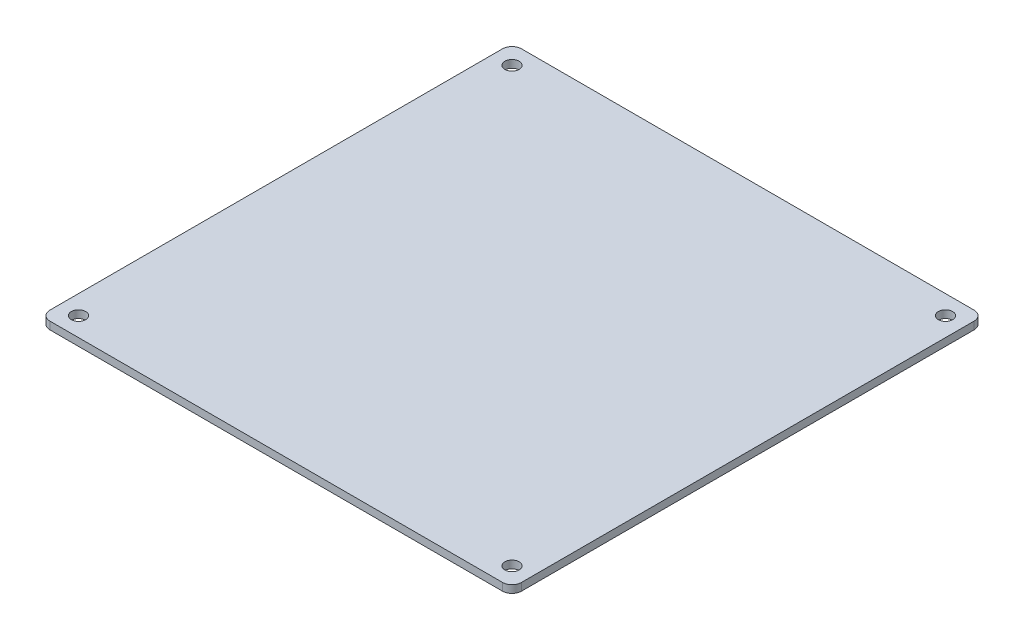
ISO-10303-21;
HEADER;
FILE_DESCRIPTION(('STEP AP214'),'2;1');
FILE_NAME('part.step','',(''),(''),'','','');
FILE_SCHEMA(('AUTOMOTIVE_DESIGN { 1 0 10303 214 1 1 1 1 }'));
ENDSEC;
DATA;
#1=APPLICATION_CONTEXT('core data for automotive mechanical design processes');
#2=APPLICATION_PROTOCOL_DEFINITION('international standard','automotive_design',2000,#1);
#3=PRODUCT_CONTEXT('',#1,'mechanical');
#4=PRODUCT('Part','Part','',(#3));
#5=PRODUCT_RELATED_PRODUCT_CATEGORY('part','',(#4));
#6=PRODUCT_DEFINITION_FORMATION('','',#4);
#7=PRODUCT_DEFINITION_CONTEXT('part definition',#1,'design');
#8=PRODUCT_DEFINITION('design','',#6,#7);
#9=PRODUCT_DEFINITION_SHAPE('','',#8);
#10=(LENGTH_UNIT() NAMED_UNIT(*) SI_UNIT(.MILLI.,.METRE.));
#11=(NAMED_UNIT(*) PLANE_ANGLE_UNIT() SI_UNIT($,.RADIAN.));
#12=(NAMED_UNIT(*) SI_UNIT($,.STERADIAN.) SOLID_ANGLE_UNIT());
#13=UNCERTAINTY_MEASURE_WITH_UNIT(LENGTH_MEASURE(1.E-05),#10,'distance_accuracy_value','');
#14=(GEOMETRIC_REPRESENTATION_CONTEXT(3) GLOBAL_UNCERTAINTY_ASSIGNED_CONTEXT((#13)) GLOBAL_UNIT_ASSIGNED_CONTEXT((#10,
#11,#12)) REPRESENTATION_CONTEXT('',''));
#15=CARTESIAN_POINT('',(0.,0.,0.));
#16=DIRECTION('',(0.,0.,1.));
#17=DIRECTION('',(1.,0.,0.));
#18=AXIS2_PLACEMENT_3D('',#15,#16,#17);
#19=CARTESIAN_POINT('',(0.,1.6,0.));
#20=DIRECTION('',(0.,-1.,0.));
#21=DIRECTION('',(0.,0.,-1.));
#22=AXIS2_PLACEMENT_3D('',#19,#20,#21);
#23=PLANE('',#22);
#24=DIRECTION('',(0.,0.,-1.));
#25=VECTOR('',#24,1.);
#26=CARTESIAN_POINT('',(49.5,1.6,49.5));
#27=LINE('',#26,#25);
#28=CARTESIAN_POINT('',(49.5,1.6,47.5));
#29=VERTEX_POINT('',#28);
#30=CARTESIAN_POINT('',(49.5,1.6,-47.5));
#31=VERTEX_POINT('',#30);
#32=EDGE_CURVE('E144',#29,#31,#27,.T.);
#33=ORIENTED_EDGE('',*,*,#32,.T.);
#34=CARTESIAN_POINT('',(47.5,1.6,-47.5));
#35=DIRECTION('',(0.,-1.,0.));
#36=DIRECTION('',(0.,0.,-1.));
#37=AXIS2_PLACEMENT_3D('',#34,#35,#36);
#38=CIRCLE('',#37,2.);
#39=CARTESIAN_POINT('',(47.5,1.6,-49.5));
#40=VERTEX_POINT('',#39);
#41=EDGE_CURVE('E159',#31,#40,#38,.F.);
#42=ORIENTED_EDGE('',*,*,#41,.T.);
#43=DIRECTION('',(-1.,0.,0.));
#44=VECTOR('',#43,1.);
#45=CARTESIAN_POINT('',(-49.5,1.6,-49.5));
#46=LINE('',#45,#44);
#47=CARTESIAN_POINT('',(-47.5,1.6,-49.5));
#48=VERTEX_POINT('',#47);
#49=EDGE_CURVE('E126',#40,#48,#46,.T.);
#50=ORIENTED_EDGE('',*,*,#49,.T.);
#51=CARTESIAN_POINT('',(-47.5,1.6,-47.5));
#52=DIRECTION('',(0.,-1.,0.));
#53=DIRECTION('',(0.,0.,-1.));
#54=AXIS2_PLACEMENT_3D('',#51,#52,#53);
#55=CIRCLE('',#54,2.);
#56=CARTESIAN_POINT('',(-49.5,1.6,-47.5));
#57=VERTEX_POINT('',#56);
#58=EDGE_CURVE('E157',#48,#57,#55,.F.);
#59=ORIENTED_EDGE('',*,*,#58,.T.);
#60=DIRECTION('',(0.,0.,1.));
#61=VECTOR('',#60,1.);
#62=CARTESIAN_POINT('',(-49.5,1.6,49.5));
#63=LINE('',#62,#61);
#64=CARTESIAN_POINT('',(-49.5,1.6,47.5));
#65=VERTEX_POINT('',#64);
#66=EDGE_CURVE('E179',#57,#65,#63,.T.);
#67=ORIENTED_EDGE('',*,*,#66,.T.);
#68=CARTESIAN_POINT('',(-47.5,1.6,47.5));
#69=DIRECTION('',(0.,-1.,0.));
#70=DIRECTION('',(0.,0.,-1.));
#71=AXIS2_PLACEMENT_3D('',#68,#69,#70);
#72=CIRCLE('',#71,2.);
#73=CARTESIAN_POINT('',(-47.5,1.6,49.5));
#74=VERTEX_POINT('',#73);
#75=EDGE_CURVE('E61',#65,#74,#72,.F.);
#76=ORIENTED_EDGE('',*,*,#75,.T.);
#77=DIRECTION('',(1.,0.,0.));
#78=VECTOR('',#77,1.);
#79=CARTESIAN_POINT('',(-49.5,1.6,49.5));
#80=LINE('',#79,#78);
#81=CARTESIAN_POINT('',(47.5,1.6,49.5));
#82=VERTEX_POINT('',#81);
#83=EDGE_CURVE('E145',#74,#82,#80,.T.);
#84=ORIENTED_EDGE('',*,*,#83,.T.);
#85=CARTESIAN_POINT('',(47.5,1.6,47.5));
#86=DIRECTION('',(0.,-1.,0.));
#87=DIRECTION('',(0.,0.,-1.));
#88=AXIS2_PLACEMENT_3D('',#85,#86,#87);
#89=CIRCLE('',#88,2.);
#90=EDGE_CURVE('E155',#82,#29,#89,.F.);
#91=ORIENTED_EDGE('',*,*,#90,.T.);
#92=EDGE_LOOP('',(#33,#42,#50,#59,#67,#76,#84,#91));
#93=FACE_BOUND('',#92,.T.);
#94=CARTESIAN_POINT('',(-45.5,1.6,-45.5));
#95=DIRECTION('',(0.,1.,0.));
#96=DIRECTION('',(0.,0.,1.));
#97=AXIS2_PLACEMENT_3D('',#94,#95,#96);
#98=CIRCLE('',#97,1.5);
#99=CARTESIAN_POINT('',(-45.5,1.6,-44.));
#100=VERTEX_POINT('',#99);
#101=EDGE_CURVE('E139',#100,#100,#98,.T.);
#102=ORIENTED_EDGE('',*,*,#101,.F.);
#103=EDGE_LOOP('',(#102));
#104=FACE_BOUND('',#103,.T.);
#105=CARTESIAN_POINT('',(45.5,1.6,-45.5));
#106=DIRECTION('',(0.,1.,0.));
#107=DIRECTION('',(0.,0.,-1.));
#108=AXIS2_PLACEMENT_3D('',#105,#106,#107);
#109=CIRCLE('',#108,1.5);
#110=CARTESIAN_POINT('',(45.5,1.6,-47.));
#111=VERTEX_POINT('',#110);
#112=EDGE_CURVE('E194',#111,#111,#109,.T.);
#113=ORIENTED_EDGE('',*,*,#112,.F.);
#114=EDGE_LOOP('',(#113));
#115=FACE_BOUND('',#114,.T.);
#116=CARTESIAN_POINT('',(45.5,1.6,45.5));
#117=DIRECTION('',(0.,1.,0.));
#118=DIRECTION('',(0.,0.,1.));
#119=AXIS2_PLACEMENT_3D('',#116,#117,#118);
#120=CIRCLE('',#119,1.5);
#121=CARTESIAN_POINT('',(45.5,1.6,47.));
#122=VERTEX_POINT('',#121);
#123=EDGE_CURVE('E198',#122,#122,#120,.T.);
#124=ORIENTED_EDGE('',*,*,#123,.F.);
#125=EDGE_LOOP('',(#124));
#126=FACE_BOUND('',#125,.T.);
#127=CARTESIAN_POINT('',(-45.5,1.6,45.5));
#128=DIRECTION('',(0.,1.,0.));
#129=DIRECTION('',(0.,0.,-1.));
#130=AXIS2_PLACEMENT_3D('',#127,#128,#129);
#131=CIRCLE('',#130,1.5);
#132=CARTESIAN_POINT('',(-45.5,1.6,44.));
#133=VERTEX_POINT('',#132);
#134=EDGE_CURVE('E201',#133,#133,#131,.T.);
#135=ORIENTED_EDGE('',*,*,#134,.F.);
#136=EDGE_LOOP('',(#135));
#137=FACE_BOUND('',#136,.T.);
#138=ADVANCED_FACE('F41',(#93,#104,#115,#126,#137),#23,.F.);
#139=CARTESIAN_POINT('',(0.,0.,0.));
#140=DIRECTION('',(0.,-1.,0.));
#141=DIRECTION('',(0.,0.,-1.));
#142=AXIS2_PLACEMENT_3D('',#139,#140,#141);
#143=PLANE('',#142);
#144=CARTESIAN_POINT('',(45.5,0.,45.5));
#145=DIRECTION('',(0.,1.,0.));
#146=DIRECTION('',(0.,0.,1.));
#147=AXIS2_PLACEMENT_3D('',#144,#145,#146);
#148=CIRCLE('',#147,1.5);
#149=CARTESIAN_POINT('',(45.5,0.,47.));
#150=VERTEX_POINT('',#149);
#151=EDGE_CURVE('E203',#150,#150,#148,.T.);
#152=ORIENTED_EDGE('',*,*,#151,.T.);
#153=EDGE_LOOP('',(#152));
#154=FACE_BOUND('',#153,.T.);
#155=CARTESIAN_POINT('',(-45.5,0.,-45.5));
#156=DIRECTION('',(0.,1.,0.));
#157=DIRECTION('',(0.,0.,1.));
#158=AXIS2_PLACEMENT_3D('',#155,#156,#157);
#159=CIRCLE('',#158,1.5);
#160=CARTESIAN_POINT('',(-45.5,0.,-44.));
#161=VERTEX_POINT('',#160);
#162=EDGE_CURVE('E182',#161,#161,#159,.T.);
#163=ORIENTED_EDGE('',*,*,#162,.T.);
#164=EDGE_LOOP('',(#163));
#165=FACE_BOUND('',#164,.T.);
#166=DIRECTION('',(-1.,0.,0.));
#167=VECTOR('',#166,1.);
#168=CARTESIAN_POINT('',(-49.5,0.,-49.5));
#169=LINE('',#168,#167);
#170=CARTESIAN_POINT('',(47.5,0.,-49.5));
#171=VERTEX_POINT('',#170);
#172=CARTESIAN_POINT('',(-47.5,0.,-49.5));
#173=VERTEX_POINT('',#172);
#174=EDGE_CURVE('E123',#171,#173,#169,.T.);
#175=ORIENTED_EDGE('',*,*,#174,.F.);
#176=CARTESIAN_POINT('',(47.5,0.,-47.5));
#177=DIRECTION('',(0.,-1.,0.));
#178=DIRECTION('',(0.,0.,-1.));
#179=AXIS2_PLACEMENT_3D('',#176,#177,#178);
#180=CIRCLE('',#179,2.);
#181=CARTESIAN_POINT('',(49.5,0.,-47.5));
#182=VERTEX_POINT('',#181);
#183=EDGE_CURVE('E106',#171,#182,#180,.T.);
#184=ORIENTED_EDGE('',*,*,#183,.T.);
#185=DIRECTION('',(0.,0.,-1.));
#186=VECTOR('',#185,1.);
#187=CARTESIAN_POINT('',(49.5,0.,49.5));
#188=LINE('',#187,#186);
#189=CARTESIAN_POINT('',(49.5,0.,47.5));
#190=VERTEX_POINT('',#189);
#191=EDGE_CURVE('E134',#190,#182,#188,.T.);
#192=ORIENTED_EDGE('',*,*,#191,.F.);
#193=CARTESIAN_POINT('',(47.5,0.,47.5));
#194=DIRECTION('',(0.,-1.,0.));
#195=DIRECTION('',(0.,0.,-1.));
#196=AXIS2_PLACEMENT_3D('',#193,#194,#195);
#197=CIRCLE('',#196,2.);
#198=CARTESIAN_POINT('',(47.5,0.,49.5));
#199=VERTEX_POINT('',#198);
#200=EDGE_CURVE('E148',#190,#199,#197,.T.);
#201=ORIENTED_EDGE('',*,*,#200,.T.);
#202=DIRECTION('',(1.,0.,0.));
#203=VECTOR('',#202,1.);
#204=CARTESIAN_POINT('',(-49.5,0.,49.5));
#205=LINE('',#204,#203);
#206=CARTESIAN_POINT('',(-47.5,0.,49.5));
#207=VERTEX_POINT('',#206);
#208=EDGE_CURVE('E137',#207,#199,#205,.T.);
#209=ORIENTED_EDGE('',*,*,#208,.F.);
#210=CARTESIAN_POINT('',(-47.5,0.,47.5));
#211=DIRECTION('',(0.,-1.,0.));
#212=DIRECTION('',(0.,0.,-1.));
#213=AXIS2_PLACEMENT_3D('',#210,#211,#212);
#214=CIRCLE('',#213,2.);
#215=CARTESIAN_POINT('',(-49.5,0.,47.5));
#216=VERTEX_POINT('',#215);
#217=EDGE_CURVE('E127',#207,#216,#214,.T.);
#218=ORIENTED_EDGE('',*,*,#217,.T.);
#219=DIRECTION('',(0.,0.,1.));
#220=VECTOR('',#219,1.);
#221=CARTESIAN_POINT('',(-49.5,0.,49.5));
#222=LINE('',#221,#220);
#223=CARTESIAN_POINT('',(-49.5,0.,-47.5));
#224=VERTEX_POINT('',#223);
#225=EDGE_CURVE('E133',#224,#216,#222,.T.);
#226=ORIENTED_EDGE('',*,*,#225,.F.);
#227=CARTESIAN_POINT('',(-47.5,0.,-47.5));
#228=DIRECTION('',(0.,-1.,0.));
#229=DIRECTION('',(0.,0.,-1.));
#230=AXIS2_PLACEMENT_3D('',#227,#228,#229);
#231=CIRCLE('',#230,2.);
#232=EDGE_CURVE('E117',#224,#173,#231,.T.);
#233=ORIENTED_EDGE('',*,*,#232,.T.);
#234=EDGE_LOOP('',(#175,#184,#192,#201,#209,#218,#226,#233));
#235=FACE_BOUND('',#234,.T.);
#236=CARTESIAN_POINT('',(45.5,0.,-45.5));
#237=DIRECTION('',(0.,1.,0.));
#238=DIRECTION('',(0.,0.,-1.));
#239=AXIS2_PLACEMENT_3D('',#236,#237,#238);
#240=CIRCLE('',#239,1.5);
#241=CARTESIAN_POINT('',(45.5,0.,-47.));
#242=VERTEX_POINT('',#241);
#243=EDGE_CURVE('E211',#242,#242,#240,.T.);
#244=ORIENTED_EDGE('',*,*,#243,.T.);
#245=EDGE_LOOP('',(#244));
#246=FACE_BOUND('',#245,.T.);
#247=CARTESIAN_POINT('',(-45.5,0.,45.5));
#248=DIRECTION('',(0.,1.,0.));
#249=DIRECTION('',(0.,0.,-1.));
#250=AXIS2_PLACEMENT_3D('',#247,#248,#249);
#251=CIRCLE('',#250,1.5);
#252=CARTESIAN_POINT('',(-45.5,0.,44.));
#253=VERTEX_POINT('',#252);
#254=EDGE_CURVE('E204',#253,#253,#251,.T.);
#255=ORIENTED_EDGE('',*,*,#254,.T.);
#256=EDGE_LOOP('',(#255));
#257=FACE_BOUND('',#256,.T.);
#258=ADVANCED_FACE('F130',(#154,#165,#235,#246,#257),#143,.T.);
#259=CARTESIAN_POINT('',(49.5,1.6,49.5));
#260=DIRECTION('',(-1.,0.,0.));
#261=DIRECTION('',(0.,0.,1.));
#262=AXIS2_PLACEMENT_3D('',#259,#260,#261);
#263=PLANE('',#262);
#264=ORIENTED_EDGE('',*,*,#191,.T.);
#265=DIRECTION('',(0.,-1.,0.));
#266=VECTOR('',#265,1.);
#267=CARTESIAN_POINT('',(49.5,1.6,-47.5));
#268=LINE('',#267,#266);
#269=EDGE_CURVE('E111',#182,#31,#268,.F.);
#270=ORIENTED_EDGE('',*,*,#269,.T.);
#271=ORIENTED_EDGE('',*,*,#32,.F.);
#272=DIRECTION('',(0.,-1.,0.));
#273=VECTOR('',#272,1.);
#274=CARTESIAN_POINT('',(49.5,1.6,47.5));
#275=LINE('',#274,#273);
#276=EDGE_CURVE('E116',#29,#190,#275,.T.);
#277=ORIENTED_EDGE('',*,*,#276,.T.);
#278=EDGE_LOOP('',(#264,#270,#271,#277));
#279=FACE_BOUND('',#278,.T.);
#280=ADVANCED_FACE('F176',(#279),#263,.F.);
#281=CARTESIAN_POINT('',(-49.5,1.6,-49.5));
#282=DIRECTION('',(0.,0.,1.));
#283=DIRECTION('',(1.,0.,0.));
#284=AXIS2_PLACEMENT_3D('',#281,#282,#283);
#285=PLANE('',#284);
#286=ORIENTED_EDGE('',*,*,#49,.F.);
#287=DIRECTION('',(0.,-1.,0.));
#288=VECTOR('',#287,1.);
#289=CARTESIAN_POINT('',(47.5,1.6,-49.5));
#290=LINE('',#289,#288);
#291=EDGE_CURVE('E110',#40,#171,#290,.T.);
#292=ORIENTED_EDGE('',*,*,#291,.T.);
#293=ORIENTED_EDGE('',*,*,#174,.T.);
#294=DIRECTION('',(0.,-1.,0.));
#295=VECTOR('',#294,1.);
#296=CARTESIAN_POINT('',(-47.5,1.6,-49.5));
#297=LINE('',#296,#295);
#298=EDGE_CURVE('E128',#173,#48,#297,.F.);
#299=ORIENTED_EDGE('',*,*,#298,.T.);
#300=EDGE_LOOP('',(#286,#292,#293,#299));
#301=FACE_BOUND('',#300,.T.);
#302=ADVANCED_FACE('F122',(#301),#285,.F.);
#303=CARTESIAN_POINT('',(-49.5,1.6,49.5));
#304=DIRECTION('',(1.,0.,0.));
#305=DIRECTION('',(0.,0.,-1.));
#306=AXIS2_PLACEMENT_3D('',#303,#304,#305);
#307=PLANE('',#306);
#308=ORIENTED_EDGE('',*,*,#66,.F.);
#309=DIRECTION('',(0.,-1.,0.));
#310=VECTOR('',#309,1.);
#311=CARTESIAN_POINT('',(-49.5,1.6,-47.5));
#312=LINE('',#311,#310);
#313=EDGE_CURVE('E163',#57,#224,#312,.T.);
#314=ORIENTED_EDGE('',*,*,#313,.T.);
#315=ORIENTED_EDGE('',*,*,#225,.T.);
#316=DIRECTION('',(0.,-1.,0.));
#317=VECTOR('',#316,1.);
#318=CARTESIAN_POINT('',(-49.5,1.6,47.5));
#319=LINE('',#318,#317);
#320=EDGE_CURVE('E161',#216,#65,#319,.F.);
#321=ORIENTED_EDGE('',*,*,#320,.T.);
#322=EDGE_LOOP('',(#308,#314,#315,#321));
#323=FACE_BOUND('',#322,.T.);
#324=ADVANCED_FACE('F231',(#323),#307,.F.);
#325=CARTESIAN_POINT('',(-49.5,1.6,49.5));
#326=DIRECTION('',(0.,0.,-1.));
#327=DIRECTION('',(-1.,0.,0.));
#328=AXIS2_PLACEMENT_3D('',#325,#326,#327);
#329=PLANE('',#328);
#330=ORIENTED_EDGE('',*,*,#208,.T.);
#331=DIRECTION('',(0.,-1.,0.));
#332=VECTOR('',#331,1.);
#333=CARTESIAN_POINT('',(47.5,1.6,49.5));
#334=LINE('',#333,#332);
#335=EDGE_CURVE('E11',#199,#82,#334,.F.);
#336=ORIENTED_EDGE('',*,*,#335,.T.);
#337=ORIENTED_EDGE('',*,*,#83,.F.);
#338=DIRECTION('',(0.,-1.,0.));
#339=VECTOR('',#338,1.);
#340=CARTESIAN_POINT('',(-47.5,1.6,49.5));
#341=LINE('',#340,#339);
#342=EDGE_CURVE('E49',#74,#207,#341,.T.);
#343=ORIENTED_EDGE('',*,*,#342,.T.);
#344=EDGE_LOOP('',(#330,#336,#337,#343));
#345=FACE_BOUND('',#344,.T.);
#346=ADVANCED_FACE('F168',(#345),#329,.F.);
#347=CARTESIAN_POINT('',(-45.5,1.6,-45.5));
#348=DIRECTION('',(0.,-1.,0.));
#349=DIRECTION('',(0.,0.,-1.));
#350=AXIS2_PLACEMENT_3D('',#347,#348,#349);
#351=CYLINDRICAL_SURFACE('',#350,1.5);
#352=ORIENTED_EDGE('',*,*,#101,.T.);
#353=EDGE_LOOP('',(#352));
#354=FACE_BOUND('',#353,.T.);
#355=ORIENTED_EDGE('',*,*,#162,.F.);
#356=EDGE_LOOP('',(#355));
#357=FACE_BOUND('',#356,.T.);
#358=ADVANCED_FACE('F220',(#354,#357),#351,.F.);
#359=CARTESIAN_POINT('',(45.5,1.6,-45.5));
#360=DIRECTION('',(0.,-1.,0.));
#361=DIRECTION('',(0.,0.,-1.));
#362=AXIS2_PLACEMENT_3D('',#359,#360,#361);
#363=CYLINDRICAL_SURFACE('',#362,1.5);
#364=ORIENTED_EDGE('',*,*,#112,.T.);
#365=EDGE_LOOP('',(#364));
#366=FACE_BOUND('',#365,.T.);
#367=ORIENTED_EDGE('',*,*,#243,.F.);
#368=EDGE_LOOP('',(#367));
#369=FACE_BOUND('',#368,.T.);
#370=ADVANCED_FACE('F222',(#366,#369),#363,.F.);
#371=CARTESIAN_POINT('',(45.5,1.6,45.5));
#372=DIRECTION('',(0.,-1.,0.));
#373=DIRECTION('',(0.,0.,-1.));
#374=AXIS2_PLACEMENT_3D('',#371,#372,#373);
#375=CYLINDRICAL_SURFACE('',#374,1.5);
#376=ORIENTED_EDGE('',*,*,#123,.T.);
#377=EDGE_LOOP('',(#376));
#378=FACE_BOUND('',#377,.T.);
#379=ORIENTED_EDGE('',*,*,#151,.F.);
#380=EDGE_LOOP('',(#379));
#381=FACE_BOUND('',#380,.T.);
#382=ADVANCED_FACE('F227',(#378,#381),#375,.F.);
#383=CARTESIAN_POINT('',(-45.5,1.6,45.5));
#384=DIRECTION('',(0.,-1.,0.));
#385=DIRECTION('',(0.,0.,-1.));
#386=AXIS2_PLACEMENT_3D('',#383,#384,#385);
#387=CYLINDRICAL_SURFACE('',#386,1.5);
#388=ORIENTED_EDGE('',*,*,#134,.T.);
#389=EDGE_LOOP('',(#388));
#390=FACE_BOUND('',#389,.T.);
#391=ORIENTED_EDGE('',*,*,#254,.F.);
#392=EDGE_LOOP('',(#391));
#393=FACE_BOUND('',#392,.T.);
#394=ADVANCED_FACE('F248',(#390,#393),#387,.F.);
#395=CARTESIAN_POINT('',(47.5,1.6,-47.5));
#396=DIRECTION('',(0.,-1.,0.));
#397=DIRECTION('',(0.,0.,-1.));
#398=AXIS2_PLACEMENT_3D('',#395,#396,#397);
#399=CYLINDRICAL_SURFACE('',#398,2.);
#400=ORIENTED_EDGE('',*,*,#41,.F.);
#401=ORIENTED_EDGE('',*,*,#269,.F.);
#402=ORIENTED_EDGE('',*,*,#183,.F.);
#403=ORIENTED_EDGE('',*,*,#291,.F.);
#404=EDGE_LOOP('',(#400,#401,#402,#403));
#405=FACE_BOUND('',#404,.T.);
#406=ADVANCED_FACE('F109',(#405),#399,.T.);
#407=CARTESIAN_POINT('',(-47.5,1.6,-47.5));
#408=DIRECTION('',(0.,-1.,0.));
#409=DIRECTION('',(0.,0.,-1.));
#410=AXIS2_PLACEMENT_3D('',#407,#408,#409);
#411=CYLINDRICAL_SURFACE('',#410,2.);
#412=ORIENTED_EDGE('',*,*,#58,.F.);
#413=ORIENTED_EDGE('',*,*,#298,.F.);
#414=ORIENTED_EDGE('',*,*,#232,.F.);
#415=ORIENTED_EDGE('',*,*,#313,.F.);
#416=EDGE_LOOP('',(#412,#413,#414,#415));
#417=FACE_BOUND('',#416,.T.);
#418=ADVANCED_FACE('F247',(#417),#411,.T.);
#419=CARTESIAN_POINT('',(47.5,1.6,47.5));
#420=DIRECTION('',(0.,-1.,0.));
#421=DIRECTION('',(0.,0.,-1.));
#422=AXIS2_PLACEMENT_3D('',#419,#420,#421);
#423=CYLINDRICAL_SURFACE('',#422,2.);
#424=ORIENTED_EDGE('',*,*,#90,.F.);
#425=ORIENTED_EDGE('',*,*,#335,.F.);
#426=ORIENTED_EDGE('',*,*,#200,.F.);
#427=ORIENTED_EDGE('',*,*,#276,.F.);
#428=EDGE_LOOP('',(#424,#425,#426,#427));
#429=FACE_BOUND('',#428,.T.);
#430=ADVANCED_FACE('F173',(#429),#423,.T.);
#431=CARTESIAN_POINT('',(-47.5,1.6,47.5));
#432=DIRECTION('',(0.,-1.,0.));
#433=DIRECTION('',(0.,0.,-1.));
#434=AXIS2_PLACEMENT_3D('',#431,#432,#433);
#435=CYLINDRICAL_SURFACE('',#434,2.);
#436=ORIENTED_EDGE('',*,*,#75,.F.);
#437=ORIENTED_EDGE('',*,*,#320,.F.);
#438=ORIENTED_EDGE('',*,*,#217,.F.);
#439=ORIENTED_EDGE('',*,*,#342,.F.);
#440=EDGE_LOOP('',(#436,#437,#438,#439));
#441=FACE_BOUND('',#440,.T.);
#442=ADVANCED_FACE('F43',(#441),#435,.T.);
#443=CLOSED_SHELL('',(#138,#258,#280,#302,#324,#346,#358,#370,#382,#394,#406,#418,#430,#442));
#444=MANIFOLD_SOLID_BREP('B2',#443);
#445=ADVANCED_BREP_SHAPE_REPRESENTATION('',(#18,#444),#14);
#446=SHAPE_DEFINITION_REPRESENTATION(#9,#445);
ENDSEC;
END-ISO-10303-21;
